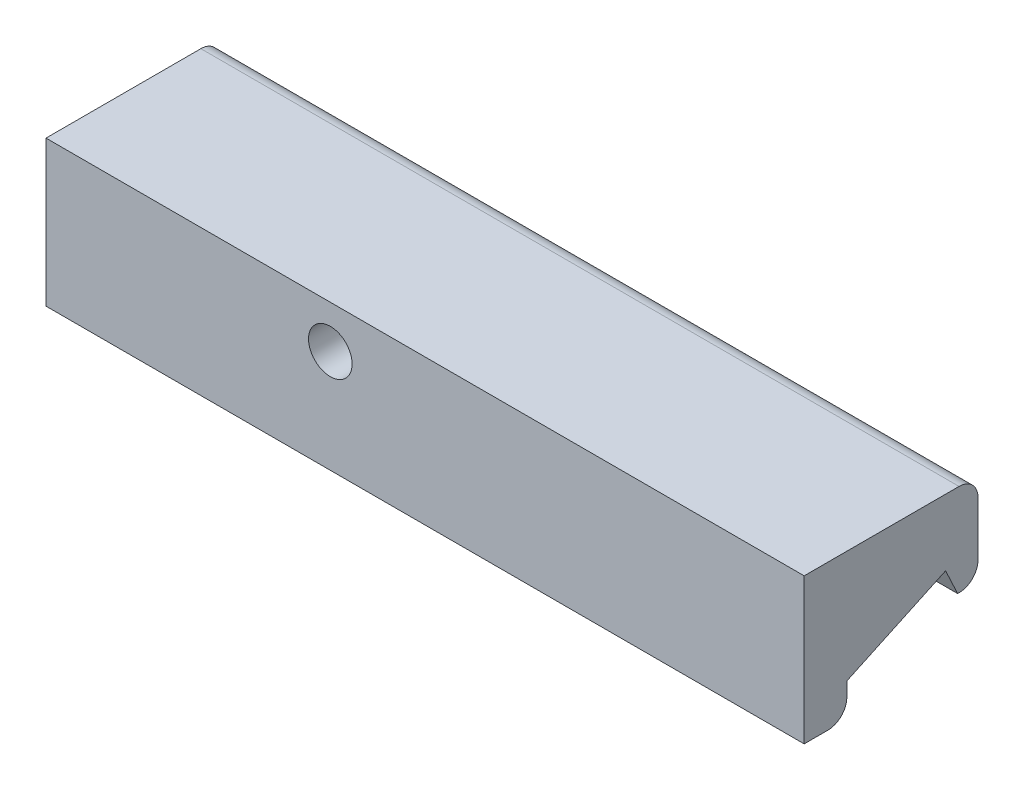
ISO-10303-21;
HEADER;
FILE_DESCRIPTION(('STEP AP214'),'2;1');
FILE_NAME('part.step','',(''),(''),'','','');
FILE_SCHEMA(('AUTOMOTIVE_DESIGN { 1 0 10303 214 1 1 1 1 }'));
ENDSEC;
DATA;
#1=APPLICATION_CONTEXT('core data for automotive mechanical design processes');
#2=APPLICATION_PROTOCOL_DEFINITION('international standard','automotive_design',2000,#1);
#3=PRODUCT_CONTEXT('',#1,'mechanical');
#4=PRODUCT('Part','Part','',(#3));
#5=PRODUCT_RELATED_PRODUCT_CATEGORY('part','',(#4));
#6=PRODUCT_DEFINITION_FORMATION('','',#4);
#7=PRODUCT_DEFINITION_CONTEXT('part definition',#1,'design');
#8=PRODUCT_DEFINITION('design','',#6,#7);
#9=PRODUCT_DEFINITION_SHAPE('','',#8);
#10=(LENGTH_UNIT() NAMED_UNIT(*) SI_UNIT(.MILLI.,.METRE.));
#11=(NAMED_UNIT(*) PLANE_ANGLE_UNIT() SI_UNIT($,.RADIAN.));
#12=(NAMED_UNIT(*) SI_UNIT($,.STERADIAN.) SOLID_ANGLE_UNIT());
#13=UNCERTAINTY_MEASURE_WITH_UNIT(LENGTH_MEASURE(1.E-05),#10,'distance_accuracy_value','');
#14=(GEOMETRIC_REPRESENTATION_CONTEXT(3) GLOBAL_UNCERTAINTY_ASSIGNED_CONTEXT((#13)) GLOBAL_UNIT_ASSIGNED_CONTEXT((#10,
#11,#12)) REPRESENTATION_CONTEXT('',''));
#15=CARTESIAN_POINT('',(0.,0.,0.));
#16=DIRECTION('',(0.,0.,1.));
#17=DIRECTION('',(1.,0.,0.));
#18=AXIS2_PLACEMENT_3D('',#15,#16,#17);
#19=CARTESIAN_POINT('',(80.,15.360110010018,0.));
#20=DIRECTION('',(0.,0.,-1.));
#21=DIRECTION('',(0.,1.,0.));
#22=AXIS2_PLACEMENT_3D('',#19,#20,#21);
#23=PLANE('',#22);
#24=CARTESIAN_POINT('',(30.,10.860110010018,0.));
#25=DIRECTION('',(0.,0.,1.));
#26=DIRECTION('',(1.,0.,0.));
#27=AXIS2_PLACEMENT_3D('',#24,#25,#26);
#28=CIRCLE('',#27,2.3);
#29=CARTESIAN_POINT('',(32.3,10.860110010018,0.));
#30=VERTEX_POINT('',#29);
#31=EDGE_CURVE('E219',#30,#30,#28,.T.);
#32=ORIENTED_EDGE('',*,*,#31,.F.);
#33=EDGE_LOOP('',(#32));
#34=FACE_BOUND('',#33,.T.);
#35=DIRECTION('',(0.,-1.,0.));
#36=VECTOR('',#35,1.);
#37=CARTESIAN_POINT('',(0.,15.360110010018,0.));
#38=LINE('',#37,#36);
#39=CARTESIAN_POINT('',(0.,15.360110010018,0.));
#40=VERTEX_POINT('',#39);
#41=CARTESIAN_POINT('',(0.,0.,0.));
#42=VERTEX_POINT('',#41);
#43=EDGE_CURVE('E147',#40,#42,#38,.T.);
#44=ORIENTED_EDGE('',*,*,#43,.T.);
#45=DIRECTION('',(-1.,0.,0.));
#46=VECTOR('',#45,1.);
#47=CARTESIAN_POINT('',(80.,0.,0.));
#48=LINE('',#47,#46);
#49=CARTESIAN_POINT('',(80.,0.,0.));
#50=VERTEX_POINT('',#49);
#51=EDGE_CURVE('E11',#50,#42,#48,.T.);
#52=ORIENTED_EDGE('',*,*,#51,.F.);
#53=DIRECTION('',(0.,-1.,0.));
#54=VECTOR('',#53,1.);
#55=CARTESIAN_POINT('',(80.,15.360110010018,0.));
#56=LINE('',#55,#54);
#57=CARTESIAN_POINT('',(80.,15.360110010018,0.));
#58=VERTEX_POINT('',#57);
#59=EDGE_CURVE('E166',#58,#50,#56,.T.);
#60=ORIENTED_EDGE('',*,*,#59,.F.);
#61=DIRECTION('',(-1.,0.,0.));
#62=VECTOR('',#61,1.);
#63=CARTESIAN_POINT('',(80.,15.360110010018,0.));
#64=LINE('',#63,#62);
#65=EDGE_CURVE('E143',#58,#40,#64,.T.);
#66=ORIENTED_EDGE('',*,*,#65,.T.);
#67=EDGE_LOOP('',(#44,#52,#60,#66));
#68=FACE_BOUND('',#67,.T.);
#69=ADVANCED_FACE('F39',(#34,#68),#23,.F.);
#70=CARTESIAN_POINT('',(80.,0.,0.));
#71=DIRECTION('',(0.,1.,0.));
#72=DIRECTION('',(0.,0.,1.));
#73=AXIS2_PLACEMENT_3D('',#70,#71,#72);
#74=PLANE('',#73);
#75=DIRECTION('',(0.,0.,-1.));
#76=VECTOR('',#75,1.);
#77=CARTESIAN_POINT('',(0.,0.,0.));
#78=LINE('',#77,#76);
#79=CARTESIAN_POINT('',(0.,0.,-2.4994615533352));
#80=VERTEX_POINT('',#79);
#81=EDGE_CURVE('E150',#42,#80,#78,.T.);
#82=ORIENTED_EDGE('',*,*,#81,.T.);
#83=DIRECTION('',(-1.,0.,0.));
#84=VECTOR('',#83,1.);
#85=CARTESIAN_POINT('',(80.,0.,-2.4994615533352));
#86=LINE('',#85,#84);
#87=CARTESIAN_POINT('',(80.,0.,-2.4994615533352));
#88=VERTEX_POINT('',#87);
#89=EDGE_CURVE('E47',#88,#80,#86,.T.);
#90=ORIENTED_EDGE('',*,*,#89,.F.);
#91=DIRECTION('',(0.,0.,-1.));
#92=VECTOR('',#91,1.);
#93=CARTESIAN_POINT('',(80.,0.,0.));
#94=LINE('',#93,#92);
#95=EDGE_CURVE('E104',#50,#88,#94,.T.);
#96=ORIENTED_EDGE('',*,*,#95,.F.);
#97=ORIENTED_EDGE('',*,*,#51,.T.);
#98=EDGE_LOOP('',(#82,#90,#96,#97));
#99=FACE_BOUND('',#98,.T.);
#100=ADVANCED_FACE('F236',(#99),#74,.F.);
#101=CARTESIAN_POINT('',(80.,2.0005384466648,-2.4994615533352));
#102=DIRECTION('',(-1.,0.,0.));
#103=DIRECTION('',(0.,0.,1.));
#104=AXIS2_PLACEMENT_3D('',#101,#102,#103);
#105=CYLINDRICAL_SURFACE('',#104,2.0005384466648);
#106=CARTESIAN_POINT('',(0.,2.0005384466648,-2.4994615533352));
#107=DIRECTION('',(1.,0.,0.));
#108=DIRECTION('',(0.,0.,-1.));
#109=AXIS2_PLACEMENT_3D('',#106,#107,#108);
#110=CIRCLE('',#109,2.0005384466648);
#111=CARTESIAN_POINT('',(0.,2.0005384466648,-4.5));
#112=VERTEX_POINT('',#111);
#113=EDGE_CURVE('E153',#80,#112,#110,.T.);
#114=ORIENTED_EDGE('',*,*,#113,.T.);
#115=DIRECTION('',(-1.,0.,0.));
#116=VECTOR('',#115,1.);
#117=CARTESIAN_POINT('',(80.,2.0005384466648,-4.5));
#118=LINE('',#117,#116);
#119=CARTESIAN_POINT('',(80.,2.0005384466648,-4.5));
#120=VERTEX_POINT('',#119);
#121=EDGE_CURVE('E179',#120,#112,#118,.T.);
#122=ORIENTED_EDGE('',*,*,#121,.F.);
#123=CARTESIAN_POINT('',(80.,2.0005384466648,-2.4994615533352));
#124=DIRECTION('',(1.,0.,0.));
#125=DIRECTION('',(0.,0.,-1.));
#126=AXIS2_PLACEMENT_3D('',#123,#124,#125);
#127=CIRCLE('',#126,2.0005384466648);
#128=EDGE_CURVE('E187',#88,#120,#127,.T.);
#129=ORIENTED_EDGE('',*,*,#128,.F.);
#130=ORIENTED_EDGE('',*,*,#89,.T.);
#131=EDGE_LOOP('',(#114,#122,#129,#130));
#132=FACE_BOUND('',#131,.T.);
#133=ADVANCED_FACE('F185',(#132),#105,.T.);
#134=CARTESIAN_POINT('',(80.,3.5,-4.5));
#135=DIRECTION('',(0.,0.,1.));
#136=DIRECTION('',(0.,-1.,0.));
#137=AXIS2_PLACEMENT_3D('',#134,#135,#136);
#138=PLANE('',#137);
#139=DIRECTION('',(0.,1.,0.));
#140=VECTOR('',#139,1.);
#141=CARTESIAN_POINT('',(0.,3.5,-4.5));
#142=LINE('',#141,#140);
#143=CARTESIAN_POINT('',(0.,3.5,-4.5));
#144=VERTEX_POINT('',#143);
#145=EDGE_CURVE('E155',#112,#144,#142,.T.);
#146=ORIENTED_EDGE('',*,*,#145,.T.);
#147=DIRECTION('',(-1.,0.,0.));
#148=VECTOR('',#147,1.);
#149=CARTESIAN_POINT('',(80.,3.5,-4.5));
#150=LINE('',#149,#148);
#151=CARTESIAN_POINT('',(80.,3.5,-4.5));
#152=VERTEX_POINT('',#151);
#153=EDGE_CURVE('E176',#152,#144,#150,.T.);
#154=ORIENTED_EDGE('',*,*,#153,.F.);
#155=DIRECTION('',(0.,1.,0.));
#156=VECTOR('',#155,1.);
#157=CARTESIAN_POINT('',(80.,3.5,-4.5));
#158=LINE('',#157,#156);
#159=EDGE_CURVE('E205',#120,#152,#158,.T.);
#160=ORIENTED_EDGE('',*,*,#159,.F.);
#161=ORIENTED_EDGE('',*,*,#121,.T.);
#162=EDGE_LOOP('',(#146,#154,#160,#161));
#163=FACE_BOUND('',#162,.T.);
#164=ADVANCED_FACE('F196',(#163),#138,.F.);
#165=CARTESIAN_POINT('',(80.,8.36011001001802,-14.9225395509215));
#166=DIRECTION('',(0.,0.906307787036651,0.422618261740697));
#167=DIRECTION('',(0.,-0.422618261740697,0.906307787036651));
#168=AXIS2_PLACEMENT_3D('',#165,#166,#167);
#169=PLANE('',#168);
#170=CARTESIAN_POINT('',(43.85,5.93005500500901,-9.71126977546074));
#171=DIRECTION('',(0.,-0.906307787036651,-0.422618261740697));
#172=DIRECTION('',(0.,0.422618261740697,-0.906307787036651));
#173=AXIS2_PLACEMENT_3D('',#170,#171,#172);
#174=CIRCLE('',#173,2.30000000000001);
#175=CARTESIAN_POINT('',(43.85,6.90207700701262,-11.795777685645));
#176=VERTEX_POINT('',#175);
#177=EDGE_CURVE('E213',#176,#176,#174,.T.);
#178=ORIENTED_EDGE('',*,*,#177,.F.);
#179=EDGE_LOOP('',(#178));
#180=FACE_BOUND('',#179,.T.);
#181=DIRECTION('',(0.,0.422618261740697,-0.906307787036651));
#182=VECTOR('',#181,1.);
#183=CARTESIAN_POINT('',(0.,8.36011001001802,-14.9225395509215));
#184=LINE('',#183,#182);
#185=CARTESIAN_POINT('',(0.,8.36011001001802,-14.9225395509215));
#186=VERTEX_POINT('',#185);
#187=EDGE_CURVE('E157',#144,#186,#184,.T.);
#188=ORIENTED_EDGE('',*,*,#187,.T.);
#189=DIRECTION('',(-1.,0.,0.));
#190=VECTOR('',#189,1.);
#191=CARTESIAN_POINT('',(80.,8.36011001001802,-14.9225395509215));
#192=LINE('',#191,#190);
#193=CARTESIAN_POINT('',(80.,8.36011001001802,-14.9225395509215));
#194=VERTEX_POINT('',#193);
#195=EDGE_CURVE('E173',#194,#186,#192,.T.);
#196=ORIENTED_EDGE('',*,*,#195,.F.);
#197=DIRECTION('',(0.,0.422618261740697,-0.906307787036651));
#198=VECTOR('',#197,1.);
#199=CARTESIAN_POINT('',(80.,8.36011001001802,-14.9225395509215));
#200=LINE('',#199,#198);
#201=EDGE_CURVE('E202',#152,#194,#200,.T.);
#202=ORIENTED_EDGE('',*,*,#201,.F.);
#203=ORIENTED_EDGE('',*,*,#153,.T.);
#204=EDGE_LOOP('',(#188,#196,#202,#203));
#205=FACE_BOUND('',#204,.T.);
#206=ADVANCED_FACE('F200',(#180,#205),#169,.F.);
#207=CARTESIAN_POINT('',(80.,5.64118664890806,-16.1903943361436));
#208=DIRECTION('',(0.,0.422618261740698,-0.906307787036651));
#209=DIRECTION('',(0.,0.906307787036651,0.422618261740698));
#210=AXIS2_PLACEMENT_3D('',#207,#208,#209);
#211=PLANE('',#210);
#212=DIRECTION('',(0.,-0.906307787036651,-0.422618261740698));
#213=VECTOR('',#212,1.);
#214=CARTESIAN_POINT('',(0.,5.64118664890806,-16.1903943361436));
#215=LINE('',#214,#213);
#216=CARTESIAN_POINT('',(0.,5.64118664890806,-16.1903943361436));
#217=VERTEX_POINT('',#216);
#218=EDGE_CURVE('E159',#186,#217,#215,.T.);
#219=ORIENTED_EDGE('',*,*,#218,.T.);
#220=DIRECTION('',(-1.,0.,0.));
#221=VECTOR('',#220,1.);
#222=CARTESIAN_POINT('',(80.,5.64118664890806,-16.1903943361436));
#223=LINE('',#222,#221);
#224=CARTESIAN_POINT('',(80.,5.64118664890806,-16.1903943361436));
#225=VERTEX_POINT('',#224);
#226=EDGE_CURVE('E170',#225,#217,#223,.T.);
#227=ORIENTED_EDGE('',*,*,#226,.F.);
#228=DIRECTION('',(0.,-0.906307787036651,-0.422618261740698));
#229=VECTOR('',#228,1.);
#230=CARTESIAN_POINT('',(80.,5.64118664890806,-16.1903943361436));
#231=LINE('',#230,#229);
#232=EDGE_CURVE('E204',#194,#225,#231,.T.);
#233=ORIENTED_EDGE('',*,*,#232,.F.);
#234=ORIENTED_EDGE('',*,*,#195,.T.);
#235=EDGE_LOOP('',(#219,#227,#233,#234));
#236=FACE_BOUND('',#235,.T.);
#237=ADVANCED_FACE('F244',(#236),#211,.F.);
#238=CARTESIAN_POINT('',(80.,7.63552847711335,-16.3407295358501));
#239=DIRECTION('',(-1.,0.,0.));
#240=DIRECTION('',(0.,0.,1.));
#241=AXIS2_PLACEMENT_3D('',#238,#239,#240);
#242=CYLINDRICAL_SURFACE('',#241,2.);
#243=CARTESIAN_POINT('',(0.,7.63552847711335,-16.3407295358501));
#244=DIRECTION('',(1.,0.,0.));
#245=DIRECTION('',(0.,0.,-1.));
#246=AXIS2_PLACEMENT_3D('',#243,#244,#245);
#247=CIRCLE('',#246,2.);
#248=CARTESIAN_POINT('',(0.,7.63552847711335,-18.3407295358501));
#249=VERTEX_POINT('',#248);
#250=EDGE_CURVE('E161',#217,#249,#247,.T.);
#251=ORIENTED_EDGE('',*,*,#250,.T.);
#252=DIRECTION('',(-1.,0.,0.));
#253=VECTOR('',#252,1.);
#254=CARTESIAN_POINT('',(80.,7.63552847711335,-18.3407295358501));
#255=LINE('',#254,#253);
#256=CARTESIAN_POINT('',(80.,7.63552847711335,-18.3407295358501));
#257=VERTEX_POINT('',#256);
#258=EDGE_CURVE('E138',#257,#249,#255,.T.);
#259=ORIENTED_EDGE('',*,*,#258,.F.);
#260=CARTESIAN_POINT('',(80.,7.63552847711335,-16.3407295358501));
#261=DIRECTION('',(1.,0.,0.));
#262=DIRECTION('',(0.,0.,-1.));
#263=AXIS2_PLACEMENT_3D('',#260,#261,#262);
#264=CIRCLE('',#263,2.);
#265=EDGE_CURVE('E129',#225,#257,#264,.T.);
#266=ORIENTED_EDGE('',*,*,#265,.F.);
#267=ORIENTED_EDGE('',*,*,#226,.T.);
#268=EDGE_LOOP('',(#251,#259,#266,#267));
#269=FACE_BOUND('',#268,.T.);
#270=ADVANCED_FACE('F241',(#269),#242,.T.);
#271=CARTESIAN_POINT('',(80.,7.63552847711335,-18.3407295358501));
#272=DIRECTION('',(0.,0.,1.));
#273=DIRECTION('',(0.,-1.,0.));
#274=AXIS2_PLACEMENT_3D('',#271,#272,#273);
#275=PLANE('',#274);
#276=DIRECTION('',(0.,1.,0.));
#277=VECTOR('',#276,1.);
#278=CARTESIAN_POINT('',(0.,7.63552847711335,-18.3407295358501));
#279=LINE('',#278,#277);
#280=CARTESIAN_POINT('',(0.,13.360110010018,-18.3407295358501));
#281=VERTEX_POINT('',#280);
#282=EDGE_CURVE('E137',#249,#281,#279,.T.);
#283=ORIENTED_EDGE('',*,*,#282,.T.);
#284=DIRECTION('',(-1.,0.,0.));
#285=VECTOR('',#284,1.);
#286=CARTESIAN_POINT('',(80.,13.360110010018,-18.3407295358501));
#287=LINE('',#286,#285);
#288=CARTESIAN_POINT('',(80.,13.360110010018,-18.3407295358501));
#289=VERTEX_POINT('',#288);
#290=EDGE_CURVE('E134',#289,#281,#287,.T.);
#291=ORIENTED_EDGE('',*,*,#290,.F.);
#292=DIRECTION('',(0.,1.,0.));
#293=VECTOR('',#292,1.);
#294=CARTESIAN_POINT('',(80.,7.63552847711335,-18.3407295358501));
#295=LINE('',#294,#293);
#296=EDGE_CURVE('E123',#257,#289,#295,.T.);
#297=ORIENTED_EDGE('',*,*,#296,.F.);
#298=ORIENTED_EDGE('',*,*,#258,.T.);
#299=EDGE_LOOP('',(#283,#291,#297,#298));
#300=FACE_BOUND('',#299,.T.);
#301=ADVANCED_FACE('F135',(#300),#275,.F.);
#302=CARTESIAN_POINT('',(80.,13.360110010018,-16.3407295358501));
#303=DIRECTION('',(-1.,0.,0.));
#304=DIRECTION('',(0.,0.,1.));
#305=AXIS2_PLACEMENT_3D('',#302,#303,#304);
#306=CYLINDRICAL_SURFACE('',#305,2.);
#307=CARTESIAN_POINT('',(0.,13.360110010018,-16.3407295358501));
#308=DIRECTION('',(1.,0.,0.));
#309=DIRECTION('',(0.,0.,1.));
#310=AXIS2_PLACEMENT_3D('',#307,#308,#309);
#311=CIRCLE('',#310,2.);
#312=CARTESIAN_POINT('',(0.,15.360110010018,-16.3407295358501));
#313=VERTEX_POINT('',#312);
#314=EDGE_CURVE('E90',#281,#313,#311,.T.);
#315=ORIENTED_EDGE('',*,*,#314,.T.);
#316=DIRECTION('',(-1.,0.,0.));
#317=VECTOR('',#316,1.);
#318=CARTESIAN_POINT('',(80.,15.360110010018,-16.3407295358501));
#319=LINE('',#318,#317);
#320=CARTESIAN_POINT('',(80.,15.360110010018,-16.3407295358501));
#321=VERTEX_POINT('',#320);
#322=EDGE_CURVE('E139',#321,#313,#319,.T.);
#323=ORIENTED_EDGE('',*,*,#322,.F.);
#324=CARTESIAN_POINT('',(80.,13.360110010018,-16.3407295358501));
#325=DIRECTION('',(1.,0.,0.));
#326=DIRECTION('',(0.,0.,1.));
#327=AXIS2_PLACEMENT_3D('',#324,#325,#326);
#328=CIRCLE('',#327,2.);
#329=EDGE_CURVE('E127',#289,#321,#328,.T.);
#330=ORIENTED_EDGE('',*,*,#329,.F.);
#331=ORIENTED_EDGE('',*,*,#290,.T.);
#332=EDGE_LOOP('',(#315,#323,#330,#331));
#333=FACE_BOUND('',#332,.T.);
#334=ADVANCED_FACE('F141',(#333),#306,.T.);
#335=CARTESIAN_POINT('',(80.,15.360110010018,-16.3407295358501));
#336=DIRECTION('',(0.,-1.,0.));
#337=DIRECTION('',(0.,0.,-1.));
#338=AXIS2_PLACEMENT_3D('',#335,#336,#337);
#339=PLANE('',#338);
#340=DIRECTION('',(0.,0.,1.));
#341=VECTOR('',#340,1.);
#342=CARTESIAN_POINT('',(0.,15.360110010018,-16.3407295358501));
#343=LINE('',#342,#341);
#344=EDGE_CURVE('E96',#313,#40,#343,.T.);
#345=ORIENTED_EDGE('',*,*,#344,.T.);
#346=ORIENTED_EDGE('',*,*,#65,.F.);
#347=DIRECTION('',(0.,0.,1.));
#348=VECTOR('',#347,1.);
#349=CARTESIAN_POINT('',(80.,15.360110010018,-16.3407295358501));
#350=LINE('',#349,#348);
#351=EDGE_CURVE('E55',#321,#58,#350,.T.);
#352=ORIENTED_EDGE('',*,*,#351,.F.);
#353=ORIENTED_EDGE('',*,*,#322,.T.);
#354=EDGE_LOOP('',(#345,#346,#352,#353));
#355=FACE_BOUND('',#354,.T.);
#356=ADVANCED_FACE('F308',(#355),#339,.F.);
#357=CARTESIAN_POINT('',(80.,2.0005384466648,-2.4994615533352));
#358=DIRECTION('',(1.,0.,0.));
#359=DIRECTION('',(0.,0.,-1.));
#360=AXIS2_PLACEMENT_3D('',#357,#358,#359);
#361=PLANE('',#360);
#362=ORIENTED_EDGE('',*,*,#59,.T.);
#363=ORIENTED_EDGE('',*,*,#95,.T.);
#364=ORIENTED_EDGE('',*,*,#128,.T.);
#365=ORIENTED_EDGE('',*,*,#159,.T.);
#366=ORIENTED_EDGE('',*,*,#201,.T.);
#367=ORIENTED_EDGE('',*,*,#232,.T.);
#368=ORIENTED_EDGE('',*,*,#265,.T.);
#369=ORIENTED_EDGE('',*,*,#296,.T.);
#370=ORIENTED_EDGE('',*,*,#329,.T.);
#371=ORIENTED_EDGE('',*,*,#351,.T.);
#372=EDGE_LOOP('',(#362,#363,#364,#365,#366,#367,#368,#369,#370,#371));
#373=FACE_BOUND('',#372,.T.);
#374=ADVANCED_FACE('F125',(#373),#361,.T.);
#375=CARTESIAN_POINT('',(0.,2.0005384466648,-2.4994615533352));
#376=DIRECTION('',(1.,0.,0.));
#377=DIRECTION('',(0.,0.,-1.));
#378=AXIS2_PLACEMENT_3D('',#375,#376,#377);
#379=PLANE('',#378);
#380=ORIENTED_EDGE('',*,*,#43,.F.);
#381=ORIENTED_EDGE('',*,*,#344,.F.);
#382=ORIENTED_EDGE('',*,*,#314,.F.);
#383=ORIENTED_EDGE('',*,*,#282,.F.);
#384=ORIENTED_EDGE('',*,*,#250,.F.);
#385=ORIENTED_EDGE('',*,*,#218,.F.);
#386=ORIENTED_EDGE('',*,*,#187,.F.);
#387=ORIENTED_EDGE('',*,*,#145,.F.);
#388=ORIENTED_EDGE('',*,*,#113,.F.);
#389=ORIENTED_EDGE('',*,*,#81,.F.);
#390=EDGE_LOOP('',(#380,#381,#382,#383,#384,#385,#386,#387,#388,#389));
#391=FACE_BOUND('',#390,.T.);
#392=ADVANCED_FACE('F191',(#391),#379,.F.);
#393=CARTESIAN_POINT('',(43.85,10.0084400466739,-7.80948759762761));
#394=DIRECTION('',(0.,-0.906307787036651,-0.422618261740697));
#395=DIRECTION('',(0.,0.422618261740697,-0.906307787036651));
#396=AXIS2_PLACEMENT_3D('',#393,#394,#395);
#397=CYLINDRICAL_SURFACE('',#396,2.30000000000001);
#398=CARTESIAN_POINT('',(43.85,10.0084400466739,-7.80948759762761));
#399=DIRECTION('',(0.,-0.906307787036651,-0.422618261740697));
#400=DIRECTION('',(0.,0.422618261740697,-0.906307787036651));
#401=AXIS2_PLACEMENT_3D('',#398,#399,#400);
#402=CIRCLE('',#401,2.30000000000001);
#403=CARTESIAN_POINT('',(43.85,10.9804620486776,-9.89399550781191));
#404=VERTEX_POINT('',#403);
#405=EDGE_CURVE('E151',#404,#404,#402,.T.);
#406=ORIENTED_EDGE('',*,*,#405,.F.);
#407=EDGE_LOOP('',(#406));
#408=FACE_BOUND('',#407,.T.);
#409=ORIENTED_EDGE('',*,*,#177,.T.);
#410=EDGE_LOOP('',(#409));
#411=FACE_BOUND('',#410,.T.);
#412=ADVANCED_FACE('F332',(#408,#411),#397,.F.);
#413=CARTESIAN_POINT('',(43.85,10.0084400466739,-7.80948759762761));
#414=DIRECTION('',(0.,-0.906307787036651,-0.422618261740697));
#415=DIRECTION('',(0.,0.422618261740697,-0.906307787036651));
#416=AXIS2_PLACEMENT_3D('',#413,#414,#415);
#417=PLANE('',#416);
#418=ORIENTED_EDGE('',*,*,#405,.T.);
#419=EDGE_LOOP('',(#418));
#420=FACE_BOUND('',#419,.T.);
#421=ADVANCED_FACE('F230',(#420),#417,.T.);
#422=CARTESIAN_POINT('',(30.,10.860110010018,-4.5));
#423=DIRECTION('',(0.,0.,1.));
#424=DIRECTION('',(1.,0.,0.));
#425=AXIS2_PLACEMENT_3D('',#422,#423,#424);
#426=CYLINDRICAL_SURFACE('',#425,2.3);
#427=CARTESIAN_POINT('',(30.,10.860110010018,-4.5));
#428=DIRECTION('',(0.,0.,1.));
#429=DIRECTION('',(1.,0.,0.));
#430=AXIS2_PLACEMENT_3D('',#427,#428,#429);
#431=CIRCLE('',#430,2.3);
#432=CARTESIAN_POINT('',(32.3,10.860110010018,-4.5));
#433=VERTEX_POINT('',#432);
#434=EDGE_CURVE('E216',#433,#433,#431,.T.);
#435=ORIENTED_EDGE('',*,*,#434,.F.);
#436=EDGE_LOOP('',(#435));
#437=FACE_BOUND('',#436,.T.);
#438=ORIENTED_EDGE('',*,*,#31,.T.);
#439=EDGE_LOOP('',(#438));
#440=FACE_BOUND('',#439,.T.);
#441=ADVANCED_FACE('F227',(#437,#440),#426,.F.);
#442=CARTESIAN_POINT('',(30.,10.860110010018,-4.5));
#443=DIRECTION('',(0.,0.,1.));
#444=DIRECTION('',(1.,0.,0.));
#445=AXIS2_PLACEMENT_3D('',#442,#443,#444);
#446=PLANE('',#445);
#447=ORIENTED_EDGE('',*,*,#434,.T.);
#448=EDGE_LOOP('',(#447));
#449=FACE_BOUND('',#448,.T.);
#450=ADVANCED_FACE('F225',(#449),#446,.T.);
#451=CLOSED_SHELL('',(#69,#100,#133,#164,#206,#237,#270,#301,#334,#356,#374,#392,#412,#421,#441,#450));
#452=MANIFOLD_SOLID_BREP('B2',#451);
#453=ADVANCED_BREP_SHAPE_REPRESENTATION('',(#18,#452),#14);
#454=SHAPE_DEFINITION_REPRESENTATION(#9,#453);
ENDSEC;
END-ISO-10303-21;
